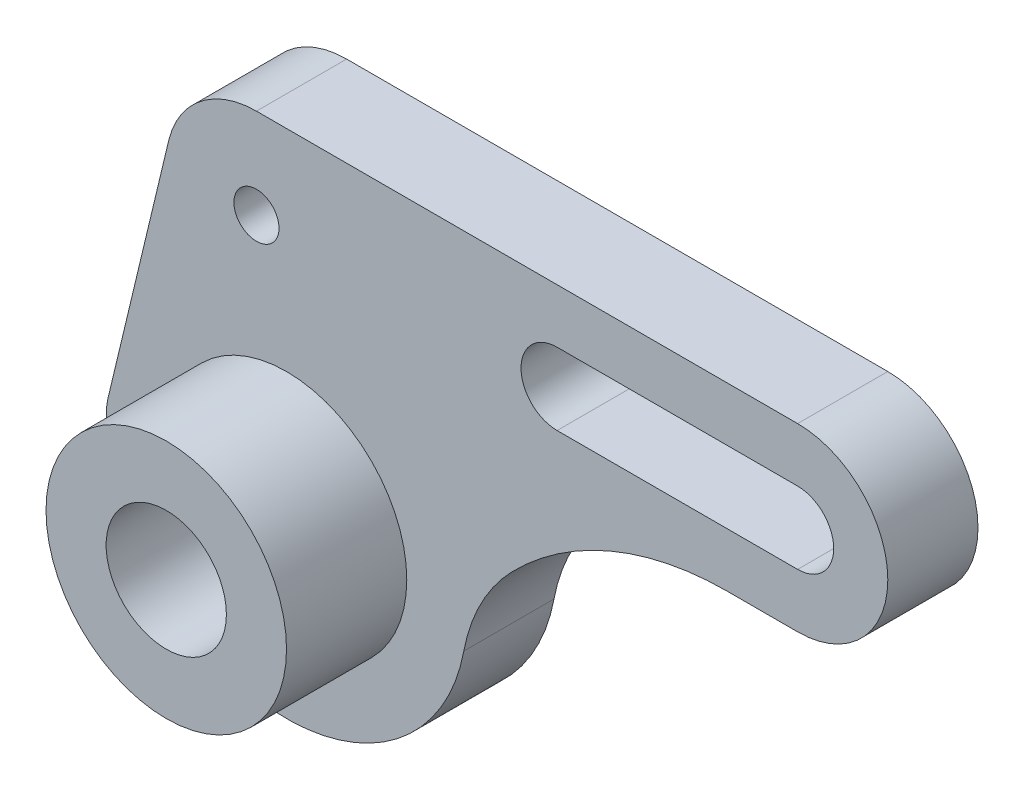
ISO-10303-21;
HEADER;
FILE_DESCRIPTION(('STEP AP214'),'2;1');
FILE_NAME('part.step','',(''),(''),'','','');
FILE_SCHEMA(('AUTOMOTIVE_DESIGN { 1 0 10303 214 1 1 1 1 }'));
ENDSEC;
DATA;
#1=APPLICATION_CONTEXT('core data for automotive mechanical design processes');
#2=APPLICATION_PROTOCOL_DEFINITION('international standard','automotive_design',2000,#1);
#3=PRODUCT_CONTEXT('',#1,'mechanical');
#4=PRODUCT('Part','Part','',(#3));
#5=PRODUCT_RELATED_PRODUCT_CATEGORY('part','',(#4));
#6=PRODUCT_DEFINITION_FORMATION('','',#4);
#7=PRODUCT_DEFINITION_CONTEXT('part definition',#1,'design');
#8=PRODUCT_DEFINITION('design','',#6,#7);
#9=PRODUCT_DEFINITION_SHAPE('','',#8);
#10=(LENGTH_UNIT() NAMED_UNIT(*) SI_UNIT(.MILLI.,.METRE.));
#11=(NAMED_UNIT(*) PLANE_ANGLE_UNIT() SI_UNIT($,.RADIAN.));
#12=(NAMED_UNIT(*) SI_UNIT($,.STERADIAN.) SOLID_ANGLE_UNIT());
#13=UNCERTAINTY_MEASURE_WITH_UNIT(LENGTH_MEASURE(1.E-05),#10,'distance_accuracy_value','');
#14=(GEOMETRIC_REPRESENTATION_CONTEXT(3) GLOBAL_UNCERTAINTY_ASSIGNED_CONTEXT((#13)) GLOBAL_UNIT_ASSIGNED_CONTEXT((#10,
#11,#12)) REPRESENTATION_CONTEXT('',''));
#15=CARTESIAN_POINT('',(0.,0.,0.));
#16=DIRECTION('',(0.,0.,1.));
#17=DIRECTION('',(1.,0.,0.));
#18=AXIS2_PLACEMENT_3D('',#15,#16,#17);
#19=CARTESIAN_POINT('',(73.301270189222,-25.,15.));
#20=DIRECTION('',(0.,0.,1.));
#21=DIRECTION('',(1.,0.,0.));
#22=AXIS2_PLACEMENT_3D('',#19,#20,#21);
#23=PLANE('',#22);
#24=CARTESIAN_POINT('',(0.,0.,15.));
#25=DIRECTION('',(0.,0.,1.));
#26=DIRECTION('',(1.,0.,0.));
#27=AXIS2_PLACEMENT_3D('',#24,#25,#26);
#28=CIRCLE('',#27,20.);
#29=CARTESIAN_POINT('',(20.,0.,15.));
#30=VERTEX_POINT('',#29);
#31=EDGE_CURVE('E537',#30,#30,#28,.T.);
#32=ORIENTED_EDGE('',*,*,#31,.F.);
#33=EDGE_LOOP('',(#32));
#34=FACE_BOUND('',#33,.T.);
#35=CARTESIAN_POINT('',(73.301270189222,-25.,15.));
#36=DIRECTION('',(0.,0.,-1.));
#37=DIRECTION('',(1.,0.,0.));
#38=AXIS2_PLACEMENT_3D('',#35,#36,#37);
#39=CIRCLE('',#38,50.);
#40=CARTESIAN_POINT('',(37.4848069638007,9.88812064330853,15.));
#41=VERTEX_POINT('',#40);
#42=CARTESIAN_POINT('',(73.301270189222,25.,15.));
#43=VERTEX_POINT('',#42);
#44=EDGE_CURVE('E195',#41,#43,#39,.T.);
#45=ORIENTED_EDGE('',*,*,#44,.T.);
#46=DIRECTION('',(1.,0.,0.));
#47=VECTOR('',#46,1.);
#48=CARTESIAN_POINT('',(73.301270189222,25.,15.));
#49=LINE('',#48,#47);
#50=CARTESIAN_POINT('',(85.,25.,15.));
#51=VERTEX_POINT('',#50);
#52=EDGE_CURVE('E199',#43,#51,#49,.T.);
#53=ORIENTED_EDGE('',*,*,#52,.T.);
#54=CARTESIAN_POINT('',(85.,40.,15.));
#55=DIRECTION('',(0.,0.,1.));
#56=DIRECTION('',(1.,0.,0.));
#57=AXIS2_PLACEMENT_3D('',#54,#55,#56);
#58=CIRCLE('',#57,15.);
#59=CARTESIAN_POINT('',(85.,55.,15.));
#60=VERTEX_POINT('',#59);
#61=EDGE_CURVE('E203',#51,#60,#58,.T.);
#62=ORIENTED_EDGE('',*,*,#61,.T.);
#63=DIRECTION('',(-1.,0.,0.));
#64=VECTOR('',#63,1.);
#65=CARTESIAN_POINT('',(45.,55.,15.));
#66=LINE('',#65,#64);
#67=CARTESIAN_POINT('',(-5.00000000000001,55.,15.));
#68=VERTEX_POINT('',#67);
#69=EDGE_CURVE('E206',#60,#68,#66,.T.);
#70=ORIENTED_EDGE('',*,*,#69,.T.);
#71=CARTESIAN_POINT('',(-5.00000000000001,40.,15.));
#72=DIRECTION('',(0.,0.,1.));
#73=DIRECTION('',(1.,0.,0.));
#74=AXIS2_PLACEMENT_3D('',#71,#72,#73);
#75=CIRCLE('',#74,15.);
#76=CARTESIAN_POINT('',(-19.5877823505607,43.4923639691004,15.));
#77=VERTEX_POINT('',#76);
#78=EDGE_CURVE('E209',#68,#77,#75,.T.);
#79=ORIENTED_EDGE('',*,*,#78,.T.);
#80=DIRECTION('',(-0.232824264606694,-0.972518823370711,0.));
#81=VECTOR('',#80,1.);
#82=CARTESIAN_POINT('',(-29.6969513330567,1.26584973218998,15.));
#83=LINE('',#82,#81);
#84=CARTESIAN_POINT('',(-29.6969513330567,1.26584973218998,15.));
#85=VERTEX_POINT('',#84);
#86=EDGE_CURVE('E212',#77,#85,#83,.T.);
#87=ORIENTED_EDGE('',*,*,#86,.T.);
#88=CARTESIAN_POINT('',(-19.9717630993496,-1.06239291387696,15.));
#89=DIRECTION('',(0.,0.,1.));
#90=DIRECTION('',(1.,0.,0.));
#91=AXIS2_PLACEMENT_3D('',#88,#89,#90);
#92=CIRCLE('',#91,10.);
#93=CARTESIAN_POINT('',(-29.9576446490245,-1.59358937081544,15.));
#94=VERTEX_POINT('',#93);
#95=EDGE_CURVE('E215',#85,#94,#92,.T.);
#96=ORIENTED_EDGE('',*,*,#95,.T.);
#97=CARTESIAN_POINT('',(0.,0.,15.));
#98=DIRECTION('',(0.,0.,1.));
#99=DIRECTION('',(1.,0.,0.));
#100=AXIS2_PLACEMENT_3D('',#97,#98,#99);
#101=CIRCLE('',#100,30.);
#102=CARTESIAN_POINT('',(29.4873424495267,-5.5223758713383,15.));
#103=VERTEX_POINT('',#102);
#104=EDGE_CURVE('E218',#94,#103,#101,.T.);
#105=ORIENTED_EDGE('',*,*,#104,.T.);
#106=CARTESIAN_POINT('',(58.9746848990534,-11.0447517426766,15.));
#107=DIRECTION('',(0.,0.,-1.));
#108=DIRECTION('',(1.,0.,0.));
#109=AXIS2_PLACEMENT_3D('',#106,#107,#108);
#110=CIRCLE('',#109,30.);
#111=EDGE_CURVE('E221',#103,#41,#110,.T.);
#112=ORIENTED_EDGE('',*,*,#111,.T.);
#113=EDGE_LOOP('',(#45,#53,#62,#70,#79,#87,#96,#105,#112));
#114=FACE_BOUND('',#113,.T.);
#115=CARTESIAN_POINT('',(-5.00000000000001,40.,15.));
#116=DIRECTION('',(0.,0.,1.));
#117=DIRECTION('',(1.,0.,0.));
#118=AXIS2_PLACEMENT_3D('',#115,#116,#117);
#119=CIRCLE('',#118,3.75);
#120=CARTESIAN_POINT('',(-1.25000000000001,40.,15.));
#121=VERTEX_POINT('',#120);
#122=EDGE_CURVE('E187',#121,#121,#119,.T.);
#123=ORIENTED_EDGE('',*,*,#122,.F.);
#124=EDGE_LOOP('',(#123));
#125=FACE_BOUND('',#124,.T.);
#126=DIRECTION('',(1.,0.,0.));
#127=VECTOR('',#126,1.);
#128=CARTESIAN_POINT('',(45.,34.,15.));
#129=LINE('',#128,#127);
#130=CARTESIAN_POINT('',(45.,34.,15.));
#131=VERTEX_POINT('',#130);
#132=CARTESIAN_POINT('',(85.,34.,15.));
#133=VERTEX_POINT('',#132);
#134=EDGE_CURVE('E146',#131,#133,#129,.T.);
#135=ORIENTED_EDGE('',*,*,#134,.F.);
#136=CARTESIAN_POINT('',(45.,40.,15.));
#137=DIRECTION('',(0.,0.,1.));
#138=DIRECTION('',(1.,0.,0.));
#139=AXIS2_PLACEMENT_3D('',#136,#137,#138);
#140=CIRCLE('',#139,6.);
#141=CARTESIAN_POINT('',(45.,46.,15.));
#142=VERTEX_POINT('',#141);
#143=EDGE_CURVE('E137',#142,#131,#140,.T.);
#144=ORIENTED_EDGE('',*,*,#143,.F.);
#145=DIRECTION('',(-1.,0.,0.));
#146=VECTOR('',#145,1.);
#147=CARTESIAN_POINT('',(45.,46.,15.));
#148=LINE('',#147,#146);
#149=CARTESIAN_POINT('',(85.,46.,15.));
#150=VERTEX_POINT('',#149);
#151=EDGE_CURVE('E163',#150,#142,#148,.T.);
#152=ORIENTED_EDGE('',*,*,#151,.F.);
#153=CARTESIAN_POINT('',(85.,40.,15.));
#154=DIRECTION('',(0.,0.,1.));
#155=DIRECTION('',(1.,0.,0.));
#156=AXIS2_PLACEMENT_3D('',#153,#154,#155);
#157=CIRCLE('',#156,6.);
#158=EDGE_CURVE('E159',#133,#150,#157,.T.);
#159=ORIENTED_EDGE('',*,*,#158,.F.);
#160=EDGE_LOOP('',(#135,#144,#152,#159));
#161=FACE_BOUND('',#160,.T.);
#162=ADVANCED_FACE('F41',(#34,#114,#125,#161),#23,.T.);
#163=CARTESIAN_POINT('',(73.301270189222,-25.,0.));
#164=DIRECTION('',(0.,0.,1.));
#165=DIRECTION('',(1.,0.,0.));
#166=AXIS2_PLACEMENT_3D('',#163,#164,#165);
#167=PLANE('',#166);
#168=CARTESIAN_POINT('',(0.,0.,0.));
#169=DIRECTION('',(0.,0.,1.));
#170=DIRECTION('',(1.,0.,0.));
#171=AXIS2_PLACEMENT_3D('',#168,#169,#170);
#172=CIRCLE('',#171,10.);
#173=CARTESIAN_POINT('',(10.,0.,0.));
#174=VERTEX_POINT('',#173);
#175=EDGE_CURVE('E530',#174,#174,#172,.F.);
#176=ORIENTED_EDGE('',*,*,#175,.F.);
#177=EDGE_LOOP('',(#176));
#178=FACE_BOUND('',#177,.T.);
#179=CARTESIAN_POINT('',(-5.00000000000001,40.,0.));
#180=DIRECTION('',(0.,0.,1.));
#181=DIRECTION('',(1.,0.,0.));
#182=AXIS2_PLACEMENT_3D('',#179,#180,#181);
#183=CIRCLE('',#182,3.75);
#184=CARTESIAN_POINT('',(-1.25000000000001,40.,0.));
#185=VERTEX_POINT('',#184);
#186=EDGE_CURVE('E155',#185,#185,#183,.T.);
#187=ORIENTED_EDGE('',*,*,#186,.T.);
#188=EDGE_LOOP('',(#187));
#189=FACE_BOUND('',#188,.T.);
#190=CARTESIAN_POINT('',(73.301270189222,-25.,0.));
#191=DIRECTION('',(0.,0.,-1.));
#192=DIRECTION('',(1.,0.,0.));
#193=AXIS2_PLACEMENT_3D('',#190,#191,#192);
#194=CIRCLE('',#193,50.);
#195=CARTESIAN_POINT('',(37.4848069638007,9.88812064330853,0.));
#196=VERTEX_POINT('',#195);
#197=CARTESIAN_POINT('',(73.301270189222,25.,0.));
#198=VERTEX_POINT('',#197);
#199=EDGE_CURVE('E191',#196,#198,#194,.T.);
#200=ORIENTED_EDGE('',*,*,#199,.F.);
#201=CARTESIAN_POINT('',(58.9746848990534,-11.0447517426766,0.));
#202=DIRECTION('',(0.,0.,-1.));
#203=DIRECTION('',(1.,0.,0.));
#204=AXIS2_PLACEMENT_3D('',#201,#202,#203);
#205=CIRCLE('',#204,30.);
#206=CARTESIAN_POINT('',(29.4873424495267,-5.5223758713383,0.));
#207=VERTEX_POINT('',#206);
#208=EDGE_CURVE('E200',#207,#196,#205,.T.);
#209=ORIENTED_EDGE('',*,*,#208,.F.);
#210=CARTESIAN_POINT('',(0.,0.,0.));
#211=DIRECTION('',(0.,0.,1.));
#212=DIRECTION('',(1.,0.,0.));
#213=AXIS2_PLACEMENT_3D('',#210,#211,#212);
#214=CIRCLE('',#213,30.);
#215=CARTESIAN_POINT('',(-29.9576446490245,-1.59358937081544,0.));
#216=VERTEX_POINT('',#215);
#217=EDGE_CURVE('E247',#216,#207,#214,.T.);
#218=ORIENTED_EDGE('',*,*,#217,.F.);
#219=CARTESIAN_POINT('',(-19.9717630993496,-1.06239291387696,0.));
#220=DIRECTION('',(0.,0.,1.));
#221=DIRECTION('',(1.,0.,0.));
#222=AXIS2_PLACEMENT_3D('',#219,#220,#221);
#223=CIRCLE('',#222,10.);
#224=CARTESIAN_POINT('',(-29.6969513330567,1.26584973218998,0.));
#225=VERTEX_POINT('',#224);
#226=EDGE_CURVE('E244',#225,#216,#223,.T.);
#227=ORIENTED_EDGE('',*,*,#226,.F.);
#228=DIRECTION('',(-0.232824264606694,-0.972518823370711,0.));
#229=VECTOR('',#228,1.);
#230=CARTESIAN_POINT('',(-29.6969513330567,1.26584973218998,0.));
#231=LINE('',#230,#229);
#232=CARTESIAN_POINT('',(-19.5877823505607,43.4923639691004,0.));
#233=VERTEX_POINT('',#232);
#234=EDGE_CURVE('E241',#233,#225,#231,.T.);
#235=ORIENTED_EDGE('',*,*,#234,.F.);
#236=CARTESIAN_POINT('',(-5.00000000000001,40.,0.));
#237=DIRECTION('',(0.,0.,1.));
#238=DIRECTION('',(1.,0.,0.));
#239=AXIS2_PLACEMENT_3D('',#236,#237,#238);
#240=CIRCLE('',#239,15.);
#241=CARTESIAN_POINT('',(-5.00000000000001,55.,0.));
#242=VERTEX_POINT('',#241);
#243=EDGE_CURVE('E238',#242,#233,#240,.T.);
#244=ORIENTED_EDGE('',*,*,#243,.F.);
#245=DIRECTION('',(-1.,0.,0.));
#246=VECTOR('',#245,1.);
#247=CARTESIAN_POINT('',(45.,55.,0.));
#248=LINE('',#247,#246);
#249=CARTESIAN_POINT('',(85.,55.,0.));
#250=VERTEX_POINT('',#249);
#251=EDGE_CURVE('E235',#250,#242,#248,.T.);
#252=ORIENTED_EDGE('',*,*,#251,.F.);
#253=CARTESIAN_POINT('',(85.,40.,0.));
#254=DIRECTION('',(0.,0.,1.));
#255=DIRECTION('',(1.,0.,0.));
#256=AXIS2_PLACEMENT_3D('',#253,#254,#255);
#257=CIRCLE('',#256,15.);
#258=CARTESIAN_POINT('',(85.,25.,0.));
#259=VERTEX_POINT('',#258);
#260=EDGE_CURVE('E231',#259,#250,#257,.T.);
#261=ORIENTED_EDGE('',*,*,#260,.F.);
#262=DIRECTION('',(1.,0.,0.));
#263=VECTOR('',#262,1.);
#264=CARTESIAN_POINT('',(73.301270189222,25.,0.));
#265=LINE('',#264,#263);
#266=EDGE_CURVE('E228',#198,#259,#265,.T.);
#267=ORIENTED_EDGE('',*,*,#266,.F.);
#268=EDGE_LOOP('',(#200,#209,#218,#227,#235,#244,#252,#261,#267));
#269=FACE_BOUND('',#268,.T.);
#270=CARTESIAN_POINT('',(45.,40.,0.));
#271=DIRECTION('',(0.,0.,1.));
#272=DIRECTION('',(1.,0.,0.));
#273=AXIS2_PLACEMENT_3D('',#270,#271,#272);
#274=CIRCLE('',#273,6.);
#275=CARTESIAN_POINT('',(45.,46.,0.));
#276=VERTEX_POINT('',#275);
#277=CARTESIAN_POINT('',(45.,34.,0.));
#278=VERTEX_POINT('',#277);
#279=EDGE_CURVE('E65',#276,#278,#274,.T.);
#280=ORIENTED_EDGE('',*,*,#279,.T.);
#281=DIRECTION('',(1.,0.,0.));
#282=VECTOR('',#281,1.);
#283=CARTESIAN_POINT('',(45.,34.,0.));
#284=LINE('',#283,#282);
#285=CARTESIAN_POINT('',(85.,34.,0.));
#286=VERTEX_POINT('',#285);
#287=EDGE_CURVE('E153',#278,#286,#284,.T.);
#288=ORIENTED_EDGE('',*,*,#287,.T.);
#289=CARTESIAN_POINT('',(85.,40.,0.));
#290=DIRECTION('',(0.,0.,1.));
#291=DIRECTION('',(1.,0.,0.));
#292=AXIS2_PLACEMENT_3D('',#289,#290,#291);
#293=CIRCLE('',#292,6.);
#294=CARTESIAN_POINT('',(85.,46.,0.));
#295=VERTEX_POINT('',#294);
#296=EDGE_CURVE('E174',#286,#295,#293,.T.);
#297=ORIENTED_EDGE('',*,*,#296,.T.);
#298=DIRECTION('',(-1.,0.,0.));
#299=VECTOR('',#298,1.);
#300=CARTESIAN_POINT('',(45.,46.,0.));
#301=LINE('',#300,#299);
#302=EDGE_CURVE('E147',#295,#276,#301,.T.);
#303=ORIENTED_EDGE('',*,*,#302,.T.);
#304=EDGE_LOOP('',(#280,#288,#297,#303));
#305=FACE_BOUND('',#304,.T.);
#306=ADVANCED_FACE('F289',(#178,#189,#269,#305),#167,.F.);
#307=CARTESIAN_POINT('',(73.301270189222,-25.,15.));
#308=DIRECTION('',(0.,0.,-1.));
#309=DIRECTION('',(-1.,0.,0.));
#310=AXIS2_PLACEMENT_3D('',#307,#308,#309);
#311=CYLINDRICAL_SURFACE('',#310,50.);
#312=ORIENTED_EDGE('',*,*,#199,.T.);
#313=DIRECTION('',(0.,0.,-1.));
#314=VECTOR('',#313,1.);
#315=CARTESIAN_POINT('',(73.301270189222,25.,15.));
#316=LINE('',#315,#314);
#317=EDGE_CURVE('E11',#43,#198,#316,.T.);
#318=ORIENTED_EDGE('',*,*,#317,.F.);
#319=ORIENTED_EDGE('',*,*,#44,.F.);
#320=DIRECTION('',(0.,0.,-1.));
#321=VECTOR('',#320,1.);
#322=CARTESIAN_POINT('',(37.4848069638007,9.88812064330853,15.));
#323=LINE('',#322,#321);
#324=EDGE_CURVE('E224',#41,#196,#323,.T.);
#325=ORIENTED_EDGE('',*,*,#324,.T.);
#326=EDGE_LOOP('',(#312,#318,#319,#325));
#327=FACE_BOUND('',#326,.T.);
#328=ADVANCED_FACE('F43',(#327),#311,.F.);
#329=CARTESIAN_POINT('',(73.301270189222,25.,15.));
#330=DIRECTION('',(0.,1.,0.));
#331=DIRECTION('',(0.,0.,1.));
#332=AXIS2_PLACEMENT_3D('',#329,#330,#331);
#333=PLANE('',#332);
#334=ORIENTED_EDGE('',*,*,#266,.T.);
#335=DIRECTION('',(0.,0.,-1.));
#336=VECTOR('',#335,1.);
#337=CARTESIAN_POINT('',(85.,25.,15.));
#338=LINE('',#337,#336);
#339=EDGE_CURVE('E50',#51,#259,#338,.T.);
#340=ORIENTED_EDGE('',*,*,#339,.F.);
#341=ORIENTED_EDGE('',*,*,#52,.F.);
#342=ORIENTED_EDGE('',*,*,#317,.T.);
#343=EDGE_LOOP('',(#334,#340,#341,#342));
#344=FACE_BOUND('',#343,.T.);
#345=ADVANCED_FACE('F307',(#344),#333,.F.);
#346=CARTESIAN_POINT('',(85.,40.,15.));
#347=DIRECTION('',(0.,0.,-1.));
#348=DIRECTION('',(-1.,0.,0.));
#349=AXIS2_PLACEMENT_3D('',#346,#347,#348);
#350=CYLINDRICAL_SURFACE('',#349,15.);
#351=ORIENTED_EDGE('',*,*,#260,.T.);
#352=DIRECTION('',(0.,0.,-1.));
#353=VECTOR('',#352,1.);
#354=CARTESIAN_POINT('',(85.,55.,15.));
#355=LINE('',#354,#353);
#356=EDGE_CURVE('E275',#60,#250,#355,.T.);
#357=ORIENTED_EDGE('',*,*,#356,.F.);
#358=ORIENTED_EDGE('',*,*,#61,.F.);
#359=ORIENTED_EDGE('',*,*,#339,.T.);
#360=EDGE_LOOP('',(#351,#357,#358,#359));
#361=FACE_BOUND('',#360,.T.);
#362=ADVANCED_FACE('F284',(#361),#350,.T.);
#363=CARTESIAN_POINT('',(45.,55.,15.));
#364=DIRECTION('',(0.,-1.,0.));
#365=DIRECTION('',(0.,0.,-1.));
#366=AXIS2_PLACEMENT_3D('',#363,#364,#365);
#367=PLANE('',#366);
#368=ORIENTED_EDGE('',*,*,#251,.T.);
#369=DIRECTION('',(0.,0.,-1.));
#370=VECTOR('',#369,1.);
#371=CARTESIAN_POINT('',(-5.00000000000001,55.,15.));
#372=LINE('',#371,#370);
#373=EDGE_CURVE('E271',#68,#242,#372,.T.);
#374=ORIENTED_EDGE('',*,*,#373,.F.);
#375=ORIENTED_EDGE('',*,*,#69,.F.);
#376=ORIENTED_EDGE('',*,*,#356,.T.);
#377=EDGE_LOOP('',(#368,#374,#375,#376));
#378=FACE_BOUND('',#377,.T.);
#379=ADVANCED_FACE('F295',(#378),#367,.F.);
#380=CARTESIAN_POINT('',(-5.00000000000001,40.,15.));
#381=DIRECTION('',(0.,0.,-1.));
#382=DIRECTION('',(-1.,0.,0.));
#383=AXIS2_PLACEMENT_3D('',#380,#381,#382);
#384=CYLINDRICAL_SURFACE('',#383,15.);
#385=ORIENTED_EDGE('',*,*,#243,.T.);
#386=DIRECTION('',(0.,0.,-1.));
#387=VECTOR('',#386,1.);
#388=CARTESIAN_POINT('',(-19.5877823505607,43.4923639691004,15.));
#389=LINE('',#388,#387);
#390=EDGE_CURVE('E267',#77,#233,#389,.T.);
#391=ORIENTED_EDGE('',*,*,#390,.F.);
#392=ORIENTED_EDGE('',*,*,#78,.F.);
#393=ORIENTED_EDGE('',*,*,#373,.T.);
#394=EDGE_LOOP('',(#385,#391,#392,#393));
#395=FACE_BOUND('',#394,.T.);
#396=ADVANCED_FACE('F299',(#395),#384,.T.);
#397=CARTESIAN_POINT('',(-29.6969513330567,1.26584973218998,15.));
#398=DIRECTION('',(0.972518823370711,-0.232824264606694,0.));
#399=DIRECTION('',(0.232824264606694,0.972518823370711,0.));
#400=AXIS2_PLACEMENT_3D('',#397,#398,#399);
#401=PLANE('',#400);
#402=ORIENTED_EDGE('',*,*,#234,.T.);
#403=DIRECTION('',(0.,0.,-1.));
#404=VECTOR('',#403,1.);
#405=CARTESIAN_POINT('',(-29.6969513330567,1.26584973218998,15.));
#406=LINE('',#405,#404);
#407=EDGE_CURVE('E263',#85,#225,#406,.T.);
#408=ORIENTED_EDGE('',*,*,#407,.F.);
#409=ORIENTED_EDGE('',*,*,#86,.F.);
#410=ORIENTED_EDGE('',*,*,#390,.T.);
#411=EDGE_LOOP('',(#402,#408,#409,#410));
#412=FACE_BOUND('',#411,.T.);
#413=ADVANCED_FACE('F325',(#412),#401,.F.);
#414=CARTESIAN_POINT('',(-19.9717630993496,-1.06239291387696,15.));
#415=DIRECTION('',(0.,0.,-1.));
#416=DIRECTION('',(-1.,0.,0.));
#417=AXIS2_PLACEMENT_3D('',#414,#415,#416);
#418=CYLINDRICAL_SURFACE('',#417,10.);
#419=ORIENTED_EDGE('',*,*,#226,.T.);
#420=DIRECTION('',(0.,0.,-1.));
#421=VECTOR('',#420,1.);
#422=CARTESIAN_POINT('',(-29.9576446490245,-1.59358937081544,15.));
#423=LINE('',#422,#421);
#424=EDGE_CURVE('E259',#94,#216,#423,.T.);
#425=ORIENTED_EDGE('',*,*,#424,.F.);
#426=ORIENTED_EDGE('',*,*,#95,.F.);
#427=ORIENTED_EDGE('',*,*,#407,.T.);
#428=EDGE_LOOP('',(#419,#425,#426,#427));
#429=FACE_BOUND('',#428,.T.);
#430=ADVANCED_FACE('F323',(#429),#418,.T.);
#431=CARTESIAN_POINT('',(0.,0.,15.));
#432=DIRECTION('',(0.,0.,-1.));
#433=DIRECTION('',(-1.,0.,0.));
#434=AXIS2_PLACEMENT_3D('',#431,#432,#433);
#435=CYLINDRICAL_SURFACE('',#434,30.);
#436=ORIENTED_EDGE('',*,*,#217,.T.);
#437=DIRECTION('',(0.,0.,-1.));
#438=VECTOR('',#437,1.);
#439=CARTESIAN_POINT('',(29.4873424495267,-5.5223758713383,15.));
#440=LINE('',#439,#438);
#441=EDGE_CURVE('E255',#103,#207,#440,.T.);
#442=ORIENTED_EDGE('',*,*,#441,.F.);
#443=ORIENTED_EDGE('',*,*,#104,.F.);
#444=ORIENTED_EDGE('',*,*,#424,.T.);
#445=EDGE_LOOP('',(#436,#442,#443,#444));
#446=FACE_BOUND('',#445,.T.);
#447=ADVANCED_FACE('F319',(#446),#435,.T.);
#448=CARTESIAN_POINT('',(58.9746848990534,-11.0447517426766,15.));
#449=DIRECTION('',(0.,0.,-1.));
#450=DIRECTION('',(-1.,0.,0.));
#451=AXIS2_PLACEMENT_3D('',#448,#449,#450);
#452=CYLINDRICAL_SURFACE('',#451,30.);
#453=ORIENTED_EDGE('',*,*,#208,.T.);
#454=ORIENTED_EDGE('',*,*,#324,.F.);
#455=ORIENTED_EDGE('',*,*,#111,.F.);
#456=ORIENTED_EDGE('',*,*,#441,.T.);
#457=EDGE_LOOP('',(#453,#454,#455,#456));
#458=FACE_BOUND('',#457,.T.);
#459=ADVANCED_FACE('F314',(#458),#452,.F.);
#460=CARTESIAN_POINT('',(-5.00000000000001,40.,15.));
#461=DIRECTION('',(0.,0.,-1.));
#462=DIRECTION('',(-1.,0.,0.));
#463=AXIS2_PLACEMENT_3D('',#460,#461,#462);
#464=CYLINDRICAL_SURFACE('',#463,3.75);
#465=ORIENTED_EDGE('',*,*,#122,.T.);
#466=EDGE_LOOP('',(#465));
#467=FACE_BOUND('',#466,.T.);
#468=ORIENTED_EDGE('',*,*,#186,.F.);
#469=EDGE_LOOP('',(#468));
#470=FACE_BOUND('',#469,.T.);
#471=ADVANCED_FACE('F344',(#467,#470),#464,.F.);
#472=CARTESIAN_POINT('',(45.,40.,15.));
#473=DIRECTION('',(0.,0.,-1.));
#474=DIRECTION('',(-1.,0.,0.));
#475=AXIS2_PLACEMENT_3D('',#472,#473,#474);
#476=CYLINDRICAL_SURFACE('',#475,6.);
#477=ORIENTED_EDGE('',*,*,#279,.F.);
#478=DIRECTION('',(0.,0.,-1.));
#479=VECTOR('',#478,1.);
#480=CARTESIAN_POINT('',(45.,46.,15.));
#481=LINE('',#480,#479);
#482=EDGE_CURVE('E141',#142,#276,#481,.T.);
#483=ORIENTED_EDGE('',*,*,#482,.F.);
#484=ORIENTED_EDGE('',*,*,#143,.T.);
#485=DIRECTION('',(0.,0.,-1.));
#486=VECTOR('',#485,1.);
#487=CARTESIAN_POINT('',(45.,34.,15.));
#488=LINE('',#487,#486);
#489=EDGE_CURVE('E140',#131,#278,#488,.T.);
#490=ORIENTED_EDGE('',*,*,#489,.T.);
#491=EDGE_LOOP('',(#477,#483,#484,#490));
#492=FACE_BOUND('',#491,.T.);
#493=ADVANCED_FACE('F139',(#492),#476,.F.);
#494=CARTESIAN_POINT('',(45.,34.,15.));
#495=DIRECTION('',(0.,1.,0.));
#496=DIRECTION('',(0.,0.,1.));
#497=AXIS2_PLACEMENT_3D('',#494,#495,#496);
#498=PLANE('',#497);
#499=ORIENTED_EDGE('',*,*,#287,.F.);
#500=ORIENTED_EDGE('',*,*,#489,.F.);
#501=ORIENTED_EDGE('',*,*,#134,.T.);
#502=DIRECTION('',(0.,0.,-1.));
#503=VECTOR('',#502,1.);
#504=CARTESIAN_POINT('',(85.,34.,15.));
#505=LINE('',#504,#503);
#506=EDGE_CURVE('E156',#133,#286,#505,.T.);
#507=ORIENTED_EDGE('',*,*,#506,.T.);
#508=EDGE_LOOP('',(#499,#500,#501,#507));
#509=FACE_BOUND('',#508,.T.);
#510=ADVANCED_FACE('F150',(#509),#498,.T.);
#511=CARTESIAN_POINT('',(85.,40.,15.));
#512=DIRECTION('',(0.,0.,-1.));
#513=DIRECTION('',(-1.,0.,0.));
#514=AXIS2_PLACEMENT_3D('',#511,#512,#513);
#515=CYLINDRICAL_SURFACE('',#514,6.);
#516=ORIENTED_EDGE('',*,*,#296,.F.);
#517=ORIENTED_EDGE('',*,*,#506,.F.);
#518=ORIENTED_EDGE('',*,*,#158,.T.);
#519=DIRECTION('',(0.,0.,-1.));
#520=VECTOR('',#519,1.);
#521=CARTESIAN_POINT('',(85.,46.,15.));
#522=LINE('',#521,#520);
#523=EDGE_CURVE('E57',#150,#295,#522,.T.);
#524=ORIENTED_EDGE('',*,*,#523,.T.);
#525=EDGE_LOOP('',(#516,#517,#518,#524));
#526=FACE_BOUND('',#525,.T.);
#527=ADVANCED_FACE('F381',(#526),#515,.F.);
#528=CARTESIAN_POINT('',(45.,46.,15.));
#529=DIRECTION('',(0.,-1.,0.));
#530=DIRECTION('',(0.,0.,-1.));
#531=AXIS2_PLACEMENT_3D('',#528,#529,#530);
#532=PLANE('',#531);
#533=ORIENTED_EDGE('',*,*,#302,.F.);
#534=ORIENTED_EDGE('',*,*,#523,.F.);
#535=ORIENTED_EDGE('',*,*,#151,.T.);
#536=ORIENTED_EDGE('',*,*,#482,.T.);
#537=EDGE_LOOP('',(#533,#534,#535,#536));
#538=FACE_BOUND('',#537,.T.);
#539=ADVANCED_FACE('F387',(#538),#532,.T.);
#540=CARTESIAN_POINT('',(0.,0.,35.));
#541=DIRECTION('',(0.,0.,-1.));
#542=DIRECTION('',(-1.,0.,0.));
#543=AXIS2_PLACEMENT_3D('',#540,#541,#542);
#544=CYLINDRICAL_SURFACE('',#543,20.);
#545=CARTESIAN_POINT('',(0.,0.,35.));
#546=DIRECTION('',(0.,0.,1.));
#547=DIRECTION('',(1.,0.,0.));
#548=AXIS2_PLACEMENT_3D('',#545,#546,#547);
#549=CIRCLE('',#548,20.);
#550=CARTESIAN_POINT('',(20.,0.,35.));
#551=VERTEX_POINT('',#550);
#552=EDGE_CURVE('E171',#551,#551,#549,.T.);
#553=ORIENTED_EDGE('',*,*,#552,.F.);
#554=EDGE_LOOP('',(#553));
#555=FACE_BOUND('',#554,.T.);
#556=ORIENTED_EDGE('',*,*,#31,.T.);
#557=EDGE_LOOP('',(#556));
#558=FACE_BOUND('',#557,.T.);
#559=ADVANCED_FACE('F394',(#555,#558),#544,.T.);
#560=CARTESIAN_POINT('',(0.,0.,35.));
#561=DIRECTION('',(0.,0.,1.));
#562=DIRECTION('',(1.,0.,0.));
#563=AXIS2_PLACEMENT_3D('',#560,#561,#562);
#564=PLANE('',#563);
#565=CARTESIAN_POINT('',(0.,0.,35.));
#566=DIRECTION('',(0.,0.,1.));
#567=DIRECTION('',(1.,0.,0.));
#568=AXIS2_PLACEMENT_3D('',#565,#566,#567);
#569=CIRCLE('',#568,10.);
#570=CARTESIAN_POINT('',(10.,0.,35.));
#571=VERTEX_POINT('',#570);
#572=EDGE_CURVE('E533',#571,#571,#569,.T.);
#573=ORIENTED_EDGE('',*,*,#572,.F.);
#574=EDGE_LOOP('',(#573));
#575=FACE_BOUND('',#574,.T.);
#576=ORIENTED_EDGE('',*,*,#552,.T.);
#577=EDGE_LOOP('',(#576));
#578=FACE_BOUND('',#577,.T.);
#579=ADVANCED_FACE('F401',(#575,#578),#564,.T.);
#580=CARTESIAN_POINT('',(0.,0.,-28.2842712474619));
#581=DIRECTION('',(0.,0.,1.));
#582=DIRECTION('',(1.,0.,0.));
#583=AXIS2_PLACEMENT_3D('',#580,#581,#582);
#584=CYLINDRICAL_SURFACE('',#583,10.);
#585=ORIENTED_EDGE('',*,*,#175,.T.);
#586=EDGE_LOOP('',(#585));
#587=FACE_BOUND('',#586,.T.);
#588=ORIENTED_EDGE('',*,*,#572,.T.);
#589=EDGE_LOOP('',(#588));
#590=FACE_BOUND('',#589,.T.);
#591=ADVANCED_FACE('F409',(#587,#590),#584,.F.);
#592=CLOSED_SHELL('',(#162,#306,#328,#345,#362,#379,#396,#413,#430,#447,#459,#471,#493,#510,
#527,#539,#559,#579,#591));
#593=MANIFOLD_SOLID_BREP('B2',#592);
#594=ADVANCED_BREP_SHAPE_REPRESENTATION('',(#18,#593),#14);
#595=SHAPE_DEFINITION_REPRESENTATION(#9,#594);
ENDSEC;
END-ISO-10303-21;
